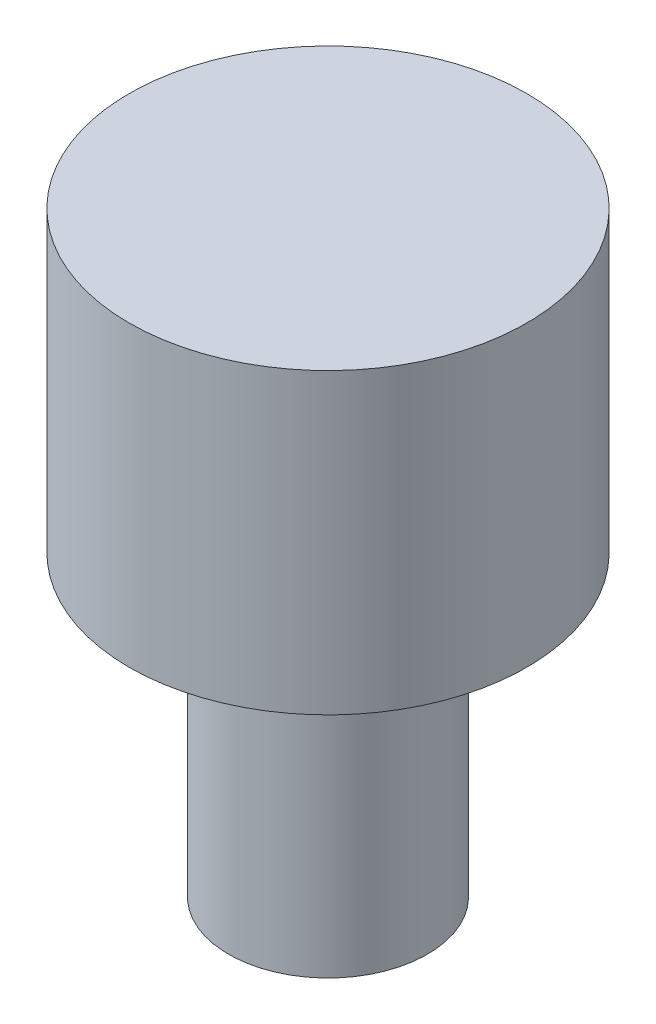
ISO-10303-21;
HEADER;
FILE_DESCRIPTION(('STEP AP214'),'2;1');
FILE_NAME('part.step','',(''),(''),'','','');
FILE_SCHEMA(('AUTOMOTIVE_DESIGN { 1 0 10303 214 1 1 1 1 }'));
ENDSEC;
DATA;
#1=APPLICATION_CONTEXT('core data for automotive mechanical design processes');
#2=APPLICATION_PROTOCOL_DEFINITION('international standard','automotive_design',2000,#1);
#3=PRODUCT_CONTEXT('',#1,'mechanical');
#4=PRODUCT('Part','Part','',(#3));
#5=PRODUCT_RELATED_PRODUCT_CATEGORY('part','',(#4));
#6=PRODUCT_DEFINITION_FORMATION('','',#4);
#7=PRODUCT_DEFINITION_CONTEXT('part definition',#1,'design');
#8=PRODUCT_DEFINITION('design','',#6,#7);
#9=PRODUCT_DEFINITION_SHAPE('','',#8);
#10=(LENGTH_UNIT() NAMED_UNIT(*) SI_UNIT(.MILLI.,.METRE.));
#11=(NAMED_UNIT(*) PLANE_ANGLE_UNIT() SI_UNIT($,.RADIAN.));
#12=(NAMED_UNIT(*) SI_UNIT($,.STERADIAN.) SOLID_ANGLE_UNIT());
#13=UNCERTAINTY_MEASURE_WITH_UNIT(LENGTH_MEASURE(1.E-05),#10,'distance_accuracy_value','');
#14=(GEOMETRIC_REPRESENTATION_CONTEXT(3) GLOBAL_UNCERTAINTY_ASSIGNED_CONTEXT((#13)) GLOBAL_UNIT_ASSIGNED_CONTEXT((#10,
#11,#12)) REPRESENTATION_CONTEXT('',''));
#15=CARTESIAN_POINT('',(0.,0.,0.));
#16=DIRECTION('',(0.,0.,1.));
#17=DIRECTION('',(1.,0.,0.));
#18=AXIS2_PLACEMENT_3D('',#15,#16,#17);
#19=CARTESIAN_POINT('',(0.,-30.,0.));
#20=DIRECTION('',(0.,1.,0.));
#21=DIRECTION('',(0.,0.,1.));
#22=AXIS2_PLACEMENT_3D('',#19,#20,#21);
#23=CYLINDRICAL_SURFACE('',#22,20.);
#24=CARTESIAN_POINT('',(0.,-30.,0.));
#25=DIRECTION('',(0.,1.,0.));
#26=DIRECTION('',(0.,0.,1.));
#27=AXIS2_PLACEMENT_3D('',#24,#25,#26);
#28=CIRCLE('',#27,20.);
#29=CARTESIAN_POINT('',(0.,-30.,20.));
#30=VERTEX_POINT('',#29);
#31=EDGE_CURVE('E38',#30,#30,#28,.T.);
#32=ORIENTED_EDGE('',*,*,#31,.T.);
#33=EDGE_LOOP('',(#32));
#34=FACE_BOUND('',#33,.T.);
#35=CARTESIAN_POINT('',(0.,0.,0.));
#36=DIRECTION('',(0.,1.,0.));
#37=DIRECTION('',(0.,0.,1.));
#38=AXIS2_PLACEMENT_3D('',#35,#36,#37);
#39=CIRCLE('',#38,20.);
#40=CARTESIAN_POINT('',(0.,0.,20.));
#41=VERTEX_POINT('',#40);
#42=EDGE_CURVE('E34',#41,#41,#39,.T.);
#43=ORIENTED_EDGE('',*,*,#42,.F.);
#44=EDGE_LOOP('',(#43));
#45=FACE_BOUND('',#44,.T.);
#46=ADVANCED_FACE('F31',(#34,#45),#23,.T.);
#47=CARTESIAN_POINT('',(0.,-30.,0.));
#48=DIRECTION('',(0.,1.,0.));
#49=DIRECTION('',(0.,0.,1.));
#50=AXIS2_PLACEMENT_3D('',#47,#48,#49);
#51=PLANE('',#50);
#52=CARTESIAN_POINT('',(0.,-30.,0.));
#53=DIRECTION('',(0.,-1.,0.));
#54=DIRECTION('',(0.,0.,-1.));
#55=AXIS2_PLACEMENT_3D('',#52,#53,#54);
#56=CIRCLE('',#55,10.);
#57=CARTESIAN_POINT('',(0.,-30.,-10.));
#58=VERTEX_POINT('',#57);
#59=EDGE_CURVE('E10',#58,#58,#56,.T.);
#60=ORIENTED_EDGE('',*,*,#59,.F.);
#61=EDGE_LOOP('',(#60));
#62=FACE_BOUND('',#61,.T.);
#63=ORIENTED_EDGE('',*,*,#31,.F.);
#64=EDGE_LOOP('',(#63));
#65=FACE_BOUND('',#64,.T.);
#66=ADVANCED_FACE('F54',(#62,#65),#51,.F.);
#67=CARTESIAN_POINT('',(0.,0.,0.));
#68=DIRECTION('',(0.,1.,0.));
#69=DIRECTION('',(0.,0.,1.));
#70=AXIS2_PLACEMENT_3D('',#67,#68,#69);
#71=PLANE('',#70);
#72=ORIENTED_EDGE('',*,*,#42,.T.);
#73=EDGE_LOOP('',(#72));
#74=FACE_BOUND('',#73,.T.);
#75=ADVANCED_FACE('F51',(#74),#71,.T.);
#76=CARTESIAN_POINT('',(0.,-60.,0.));
#77=DIRECTION('',(0.,1.,0.));
#78=DIRECTION('',(0.,0.,1.));
#79=AXIS2_PLACEMENT_3D('',#76,#77,#78);
#80=CYLINDRICAL_SURFACE('',#79,10.);
#81=CARTESIAN_POINT('',(0.,-60.,0.));
#82=DIRECTION('',(0.,-1.,0.));
#83=DIRECTION('',(0.,0.,-1.));
#84=AXIS2_PLACEMENT_3D('',#81,#82,#83);
#85=CIRCLE('',#84,10.);
#86=CARTESIAN_POINT('',(0.,-60.,-10.));
#87=VERTEX_POINT('',#86);
#88=EDGE_CURVE('E44',#87,#87,#85,.T.);
#89=ORIENTED_EDGE('',*,*,#88,.F.);
#90=EDGE_LOOP('',(#89));
#91=FACE_BOUND('',#90,.T.);
#92=ORIENTED_EDGE('',*,*,#59,.T.);
#93=EDGE_LOOP('',(#92));
#94=FACE_BOUND('',#93,.T.);
#95=ADVANCED_FACE('F66',(#91,#94),#80,.T.);
#96=CARTESIAN_POINT('',(0.,-60.,0.));
#97=DIRECTION('',(0.,-1.,0.));
#98=DIRECTION('',(0.,0.,-1.));
#99=AXIS2_PLACEMENT_3D('',#96,#97,#98);
#100=PLANE('',#99);
#101=ORIENTED_EDGE('',*,*,#88,.T.);
#102=EDGE_LOOP('',(#101));
#103=FACE_BOUND('',#102,.T.);
#104=ADVANCED_FACE('F70',(#103),#100,.T.);
#105=CLOSED_SHELL('',(#46,#66,#75,#95,#104));
#106=MANIFOLD_SOLID_BREP('B2',#105);
#107=ADVANCED_BREP_SHAPE_REPRESENTATION('',(#18,#106),#14);
#108=SHAPE_DEFINITION_REPRESENTATION(#9,#107);
ENDSEC;
END-ISO-10303-21;
